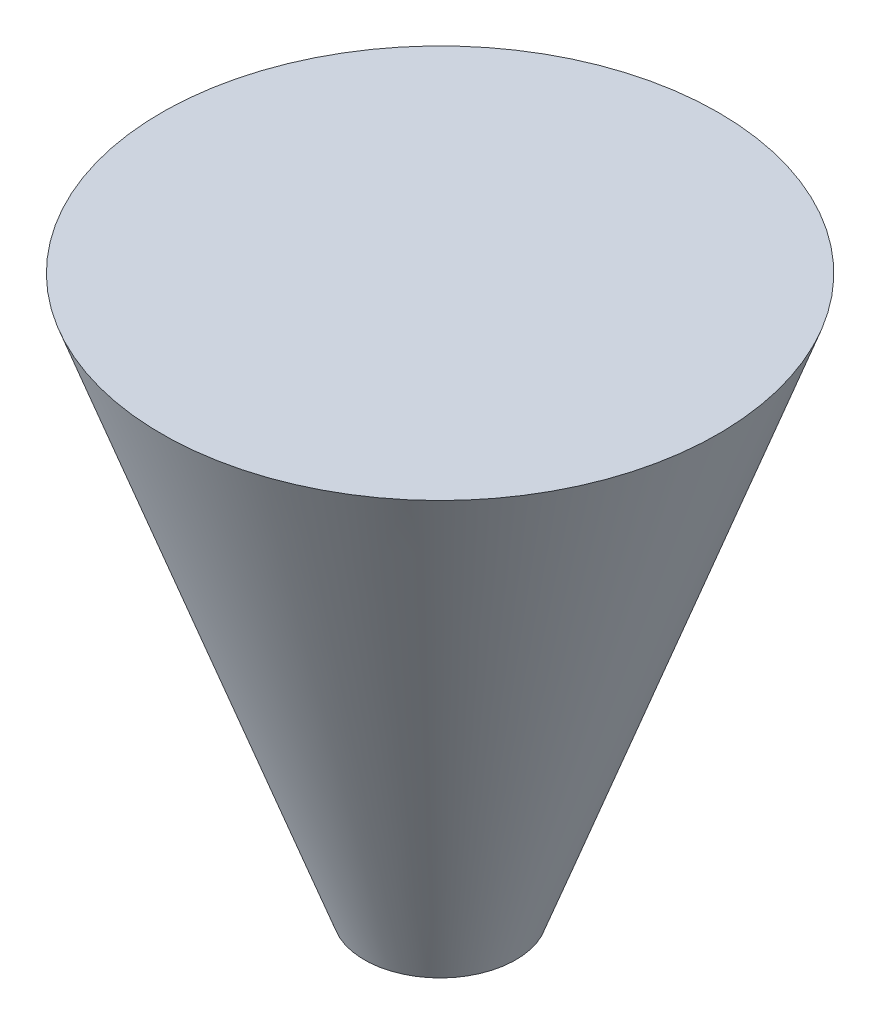
ISO-10303-21;
HEADER;
FILE_DESCRIPTION(('STEP AP214'),'2;1');
FILE_NAME('part.step','',(''),(''),'','','');
FILE_SCHEMA(('AUTOMOTIVE_DESIGN { 1 0 10303 214 1 1 1 1 }'));
ENDSEC;
DATA;
#1=APPLICATION_CONTEXT('core data for automotive mechanical design processes');
#2=APPLICATION_PROTOCOL_DEFINITION('international standard','automotive_design',2000,#1);
#3=PRODUCT_CONTEXT('',#1,'mechanical');
#4=PRODUCT('Part','Part','',(#3));
#5=PRODUCT_RELATED_PRODUCT_CATEGORY('part','',(#4));
#6=PRODUCT_DEFINITION_FORMATION('','',#4);
#7=PRODUCT_DEFINITION_CONTEXT('part definition',#1,'design');
#8=PRODUCT_DEFINITION('design','',#6,#7);
#9=PRODUCT_DEFINITION_SHAPE('','',#8);
#10=(LENGTH_UNIT() NAMED_UNIT(*) SI_UNIT(.MILLI.,.METRE.));
#11=(NAMED_UNIT(*) PLANE_ANGLE_UNIT() SI_UNIT($,.RADIAN.));
#12=(NAMED_UNIT(*) SI_UNIT($,.STERADIAN.) SOLID_ANGLE_UNIT());
#13=UNCERTAINTY_MEASURE_WITH_UNIT(LENGTH_MEASURE(1.E-05),#10,'distance_accuracy_value','');
#14=(GEOMETRIC_REPRESENTATION_CONTEXT(3) GLOBAL_UNCERTAINTY_ASSIGNED_CONTEXT((#13)) GLOBAL_UNIT_ASSIGNED_CONTEXT((#10,
#11,#12)) REPRESENTATION_CONTEXT('',''));
#15=CARTESIAN_POINT('',(0.,0.,0.));
#16=DIRECTION('',(0.,0.,1.));
#17=DIRECTION('',(1.,0.,0.));
#18=AXIS2_PLACEMENT_3D('',#15,#16,#17);
#19=CARTESIAN_POINT('',(0.,0.,0.));
#20=DIRECTION('',(0.,1.,0.));
#21=DIRECTION('',(0.,0.,-1.));
#22=AXIS2_PLACEMENT_3D('',#19,#20,#21);
#23=CONICAL_SURFACE('',#22,1.5,0.349065850398867);
#24=CARTESIAN_POINT('',(0.,-3.,0.));
#25=DIRECTION('',(0.,-1.,0.));
#26=DIRECTION('',(0.,0.,-1.));
#27=AXIS2_PLACEMENT_3D('',#24,#25,#26);
#28=CIRCLE('',#27,0.40808929720139);
#29=CARTESIAN_POINT('',(0.,-3.,-0.40808929720139));
#30=VERTEX_POINT('',#29);
#31=EDGE_CURVE('E10',#30,#30,#28,.T.);
#32=CARTESIAN_POINT('',(0.,0.,0.));
#33=DIRECTION('',(0.,-1.,0.));
#34=DIRECTION('',(0.,0.,-1.));
#35=AXIS2_PLACEMENT_3D('',#32,#33,#34);
#36=CIRCLE('',#35,1.5);
#37=CARTESIAN_POINT('',(0.,0.,-1.5));
#38=VERTEX_POINT('',#37);
#39=EDGE_CURVE('E36',#38,#38,#36,.T.);
#40=CARTESIAN_POINT('',(0.,-3.,-0.40808929720139));
#41=CARTESIAN_POINT('',(0.,-2.96875,-0.419463367022209));
#42=CARTESIAN_POINT('',(0.,-2.9375,-0.430837436843027));
#43=CARTESIAN_POINT('',(0.,-2.875,-0.453585576484665));
#44=CARTESIAN_POINT('',(0.,-2.84375,-0.464959646305484));
#45=CARTESIAN_POINT('',(0.,-2.78125,-0.487707785947122));
#46=CARTESIAN_POINT('',(0.,-2.75,-0.499081855767941));
#47=CARTESIAN_POINT('',(0.,-2.6875,-0.521829995409578));
#48=CARTESIAN_POINT('',(0.,-2.65625,-0.533204065230397));
#49=CARTESIAN_POINT('',(0.,-2.59375,-0.555952204872035));
#50=CARTESIAN_POINT('',(0.,-2.5625,-0.567326274692854));
#51=CARTESIAN_POINT('',(0.,-2.5,-0.590074414334491));
#52=CARTESIAN_POINT('',(0.,-2.46875,-0.60144848415531));
#53=CARTESIAN_POINT('',(0.,-2.40625,-0.624196623796948));
#54=CARTESIAN_POINT('',(0.,-2.375,-0.635570693617767));
#55=CARTESIAN_POINT('',(0.,-2.3125,-0.658318833259405));
#56=CARTESIAN_POINT('',(0.,-2.28125,-0.669692903080223));
#57=CARTESIAN_POINT('',(0.,-2.21875,-0.692441042721861));
#58=CARTESIAN_POINT('',(0.,-2.1875,-0.70381511254268));
#59=CARTESIAN_POINT('',(0.,-2.125,-0.726563252184318));
#60=CARTESIAN_POINT('',(0.,-2.09375,-0.737937322005137));
#61=CARTESIAN_POINT('',(0.,-2.03125,-0.760685461646774));
#62=CARTESIAN_POINT('',(0.,-2.,-0.772059531467593));
#63=CARTESIAN_POINT('',(0.,-1.9375,-0.794807671109231));
#64=CARTESIAN_POINT('',(0.,-1.90625,-0.80618174093005));
#65=CARTESIAN_POINT('',(0.,-1.84375,-0.828929880571687));
#66=CARTESIAN_POINT('',(0.,-1.8125,-0.840303950392506));
#67=CARTESIAN_POINT('',(0.,-1.75,-0.863052090034144));
#68=CARTESIAN_POINT('',(0.,-1.71875,-0.874426159854963));
#69=CARTESIAN_POINT('',(0.,-1.65625,-0.8971742994966));
#70=CARTESIAN_POINT('',(0.,-1.625,-0.908548369317419));
#71=CARTESIAN_POINT('',(0.,-1.5625,-0.931296508959057));
#72=CARTESIAN_POINT('',(0.,-1.53125,-0.942670578779876));
#73=CARTESIAN_POINT('',(0.,-1.46875,-0.965418718421514));
#74=CARTESIAN_POINT('',(0.,-1.4375,-0.976792788242333));
#75=CARTESIAN_POINT('',(0.,-1.375,-0.99954092788397));
#76=CARTESIAN_POINT('',(0.,-1.34375,-1.01091499770479));
#77=CARTESIAN_POINT('',(0.,-1.28125,-1.03366313734643));
#78=CARTESIAN_POINT('',(0.,-1.25,-1.04503720716725));
#79=CARTESIAN_POINT('',(0.,-1.1875,-1.06778534680888));
#80=CARTESIAN_POINT('',(0.,-1.15625,-1.0791594166297));
#81=CARTESIAN_POINT('',(0.,-1.09375,-1.10190755627134));
#82=CARTESIAN_POINT('',(0.,-1.0625,-1.11328162609216));
#83=CARTESIAN_POINT('',(0.,-1.,-1.1360297657338));
#84=CARTESIAN_POINT('',(0.,-0.96875,-1.14740383555462));
#85=CARTESIAN_POINT('',(0.,-0.90625,-1.17015197519625));
#86=CARTESIAN_POINT('',(0.,-0.875,-1.18152604501707));
#87=CARTESIAN_POINT('',(0.,-0.8125,-1.20427418465871));
#88=CARTESIAN_POINT('',(0.,-0.78125,-1.21564825447953));
#89=CARTESIAN_POINT('',(0.,-0.71875,-1.23839639412117));
#90=CARTESIAN_POINT('',(0.,-0.6875,-1.24977046394198));
#91=CARTESIAN_POINT('',(0.,-0.625,-1.27251860358362));
#92=CARTESIAN_POINT('',(0.,-0.59375,-1.28389267340444));
#93=CARTESIAN_POINT('',(0.,-0.53125,-1.30664081304608));
#94=CARTESIAN_POINT('',(0.,-0.5,-1.3180148828669));
#95=CARTESIAN_POINT('',(0.,-0.4375,-1.34076302250854));
#96=CARTESIAN_POINT('',(0.,-0.40625,-1.35213709232935));
#97=CARTESIAN_POINT('',(0.,-0.34375,-1.37488523197099));
#98=CARTESIAN_POINT('',(0.,-0.3125,-1.38625930179181));
#99=CARTESIAN_POINT('',(0.,-0.25,-1.40900744143345));
#100=CARTESIAN_POINT('',(0.,-0.21875,-1.42038151125427));
#101=CARTESIAN_POINT('',(0.,-0.15625,-1.44312965089591));
#102=CARTESIAN_POINT('',(0.,-0.125,-1.45450372071672));
#103=CARTESIAN_POINT('',(0.,-0.0625000000000001,-1.47725186035836));
#104=CARTESIAN_POINT('',(0.,-0.03125,-1.48862593017918));
#105=CARTESIAN_POINT('',(0.,0.,-1.5));
#106=B_SPLINE_CURVE_WITH_KNOTS('',3,(#40,#41,#42,#43,#44,#45,#46,#47,#48,#49,#50,#51,#52,#53,
#54,#55,#56,#57,#58,#59,#60,#61,#62,#63,#64,#65,#66,#67,#68,#69,#70,#71,#72,#73,#74,#75,#76,#77,
#78,#79,#80,#81,#82,#83,#84,#85,#86,#87,#88,#89,#90,#91,#92,#93,#94,#95,#96,#97,#98,#99,#100,
#101,#102,#103,#104,#105),.UNSPECIFIED.,.F.,.F.,(4,2,2,2,2,2,2,2,2,2,2,2,2,2,2,2,2,2,2,2,2,2,2,
2,2,2,2,2,2,2,2,2,4),(0.,0.0997666661696168,0.199533332339234,0.299299998508851,
0.399066664678467,0.498833330848084,0.598599997017701,0.698366663187318,0.798133329356934,
0.897899995526551,0.997666661696168,1.09743332786578,1.1971999940354,1.29696666020502,
1.39673332637464,1.49649999254425,1.59626665871387,1.69603332488349,1.7957999910531,
1.89556665722272,1.99533332339234,2.09509998956195,2.19486665573157,2.29463332190119,
2.3943999880708,2.49416665424042,2.59393332041004,2.69369998657965,2.79346665274927,
2.89323331891889,2.9929999850885,3.09276665125812,3.19253331742774),.UNSPECIFIED.);
#107=EDGE_CURVE('BSEAM30',#30,#38,#106,.T.);
#108=ORIENTED_EDGE('',*,*,#31,.F.);
#109=ORIENTED_EDGE('',*,*,#39,.T.);
#110=ORIENTED_EDGE('',*,*,#107,.T.);
#111=ORIENTED_EDGE('',*,*,#107,.F.);
#112=EDGE_LOOP('',(#108,#110,#109,#111));
#113=FACE_BOUND('',#112,.T.);
#114=ADVANCED_FACE('F30',(#113),#23,.T.);
#115=CARTESIAN_POINT('',(0.,-3.,0.));
#116=DIRECTION('',(0.,-1.,0.));
#117=DIRECTION('',(0.,0.,-1.));
#118=AXIS2_PLACEMENT_3D('',#115,#116,#117);
#119=PLANE('',#118);
#120=ORIENTED_EDGE('',*,*,#31,.T.);
#121=EDGE_LOOP('',(#120));
#122=FACE_BOUND('',#121,.T.);
#123=ADVANCED_FACE('F45',(#122),#119,.T.);
#124=CARTESIAN_POINT('',(-101.845255910092,0.,60.));
#125=DIRECTION('',(0.,-1.,0.));
#126=DIRECTION('',(0.,0.,-1.));
#127=AXIS2_PLACEMENT_3D('',#124,#125,#126);
#128=PLANE('',#127);
#129=ORIENTED_EDGE('',*,*,#39,.F.);
#130=EDGE_LOOP('',(#129));
#131=FACE_BOUND('',#130,.T.);
#132=ADVANCED_FACE('F43',(#131),#128,.F.);
#133=CLOSED_SHELL('',(#114,#123,#132));
#134=MANIFOLD_SOLID_BREP('B2',#133);
#135=ADVANCED_BREP_SHAPE_REPRESENTATION('',(#18,#134),#14);
#136=SHAPE_DEFINITION_REPRESENTATION(#9,#135);
ENDSEC;
END-ISO-10303-21;
